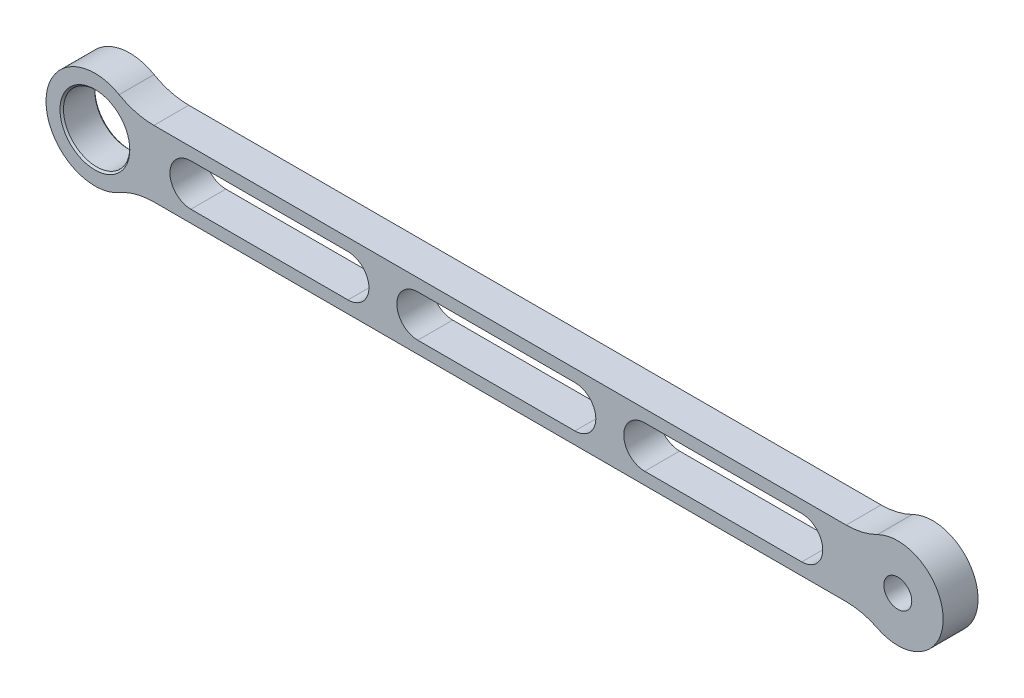
ISO-10303-21;
HEADER;
FILE_DESCRIPTION(('STEP AP214'),'2;1');
FILE_NAME('part.step','',(''),(''),'','','');
FILE_SCHEMA(('AUTOMOTIVE_DESIGN { 1 0 10303 214 1 1 1 1 }'));
ENDSEC;
DATA;
#1=APPLICATION_CONTEXT('core data for automotive mechanical design processes');
#2=APPLICATION_PROTOCOL_DEFINITION('international standard','automotive_design',2000,#1);
#3=PRODUCT_CONTEXT('',#1,'mechanical');
#4=PRODUCT('Part','Part','',(#3));
#5=PRODUCT_RELATED_PRODUCT_CATEGORY('part','',(#4));
#6=PRODUCT_DEFINITION_FORMATION('','',#4);
#7=PRODUCT_DEFINITION_CONTEXT('part definition',#1,'design');
#8=PRODUCT_DEFINITION('design','',#6,#7);
#9=PRODUCT_DEFINITION_SHAPE('','',#8);
#10=(LENGTH_UNIT() NAMED_UNIT(*) SI_UNIT(.MILLI.,.METRE.));
#11=(NAMED_UNIT(*) PLANE_ANGLE_UNIT() SI_UNIT($,.RADIAN.));
#12=(NAMED_UNIT(*) SI_UNIT($,.STERADIAN.) SOLID_ANGLE_UNIT());
#13=UNCERTAINTY_MEASURE_WITH_UNIT(LENGTH_MEASURE(1.E-05),#10,'distance_accuracy_value','');
#14=(GEOMETRIC_REPRESENTATION_CONTEXT(3) GLOBAL_UNCERTAINTY_ASSIGNED_CONTEXT((#13)) GLOBAL_UNIT_ASSIGNED_CONTEXT((#10,
#11,#12)) REPRESENTATION_CONTEXT('',''));
#15=CARTESIAN_POINT('',(0.,0.,0.));
#16=DIRECTION('',(0.,0.,1.));
#17=DIRECTION('',(1.,0.,0.));
#18=AXIS2_PLACEMENT_3D('',#15,#16,#17);
#19=CARTESIAN_POINT('',(215.20980054225,-29.5,10.));
#20=DIRECTION('',(0.,0.,-1.));
#21=DIRECTION('',(-1.,0.,0.));
#22=AXIS2_PLACEMENT_3D('',#19,#20,#21);
#23=CYLINDRICAL_SURFACE('',#22,20.);
#24=CARTESIAN_POINT('',(215.20980054225,-29.5,0.));
#25=DIRECTION('',(0.,0.,1.));
#26=DIRECTION('',(1.,0.,0.));
#27=AXIS2_PLACEMENT_3D('',#24,#25,#26);
#28=CIRCLE('',#27,20.);
#29=CARTESIAN_POINT('',(215.20980054225,-9.5,0.));
#30=VERTEX_POINT('',#29);
#31=CARTESIAN_POINT('',(224.173557789371,-11.6212121212123,0.));
#32=VERTEX_POINT('',#31);
#33=EDGE_CURVE('E274',#30,#32,#28,.F.);
#34=ORIENTED_EDGE('',*,*,#33,.T.);
#35=DIRECTION('',(0.,0.,-1.));
#36=VECTOR('',#35,1.);
#37=CARTESIAN_POINT('',(224.173557789371,-11.6212121212123,10.));
#38=LINE('',#37,#36);
#39=CARTESIAN_POINT('',(224.173557789371,-11.6212121212123,10.));
#40=VERTEX_POINT('',#39);
#41=EDGE_CURVE('E338',#40,#32,#38,.T.);
#42=ORIENTED_EDGE('',*,*,#41,.F.);
#43=CARTESIAN_POINT('',(215.20980054225,-29.5,10.));
#44=DIRECTION('',(0.,0.,1.));
#45=DIRECTION('',(1.,0.,0.));
#46=AXIS2_PLACEMENT_3D('',#43,#44,#45);
#47=CIRCLE('',#46,20.);
#48=CARTESIAN_POINT('',(215.20980054225,-9.5,10.));
#49=VERTEX_POINT('',#48);
#50=EDGE_CURVE('E281',#49,#40,#47,.F.);
#51=ORIENTED_EDGE('',*,*,#50,.F.);
#52=DIRECTION('',(0.,0.,-1.));
#53=VECTOR('',#52,1.);
#54=CARTESIAN_POINT('',(215.20980054225,-9.5,10.));
#55=LINE('',#54,#53);
#56=EDGE_CURVE('E302',#49,#30,#55,.T.);
#57=ORIENTED_EDGE('',*,*,#56,.T.);
#58=EDGE_LOOP('',(#34,#42,#51,#57));
#59=FACE_BOUND('',#58,.T.);
#60=ADVANCED_FACE('F38',(#59),#23,.F.);
#61=CARTESIAN_POINT('',(230.,0.,10.));
#62=DIRECTION('',(0.,0.,-1.));
#63=DIRECTION('',(-1.,0.,0.));
#64=AXIS2_PLACEMENT_3D('',#61,#62,#63);
#65=CYLINDRICAL_SURFACE('',#64,13.0000000000003);
#66=CARTESIAN_POINT('',(230.,0.,0.));
#67=DIRECTION('',(0.,0.,1.));
#68=DIRECTION('',(1.,0.,0.));
#69=AXIS2_PLACEMENT_3D('',#66,#67,#68);
#70=CIRCLE('',#69,13.0000000000003);
#71=CARTESIAN_POINT('',(224.173557789371,11.6212121212123,0.));
#72=VERTEX_POINT('',#71);
#73=EDGE_CURVE('E305',#32,#72,#70,.T.);
#74=ORIENTED_EDGE('',*,*,#73,.T.);
#75=DIRECTION('',(0.,0.,-1.));
#76=VECTOR('',#75,1.);
#77=CARTESIAN_POINT('',(224.173557789371,11.6212121212123,10.));
#78=LINE('',#77,#76);
#79=CARTESIAN_POINT('',(224.173557789371,11.6212121212123,10.));
#80=VERTEX_POINT('',#79);
#81=EDGE_CURVE('E335',#80,#72,#78,.T.);
#82=ORIENTED_EDGE('',*,*,#81,.F.);
#83=CARTESIAN_POINT('',(230.,0.,10.));
#84=DIRECTION('',(0.,0.,1.));
#85=DIRECTION('',(1.,0.,0.));
#86=AXIS2_PLACEMENT_3D('',#83,#84,#85);
#87=CIRCLE('',#86,13.0000000000003);
#88=EDGE_CURVE('E284',#40,#80,#87,.T.);
#89=ORIENTED_EDGE('',*,*,#88,.F.);
#90=ORIENTED_EDGE('',*,*,#41,.T.);
#91=EDGE_LOOP('',(#74,#82,#89,#90));
#92=FACE_BOUND('',#91,.T.);
#93=ADVANCED_FACE('F385',(#92),#65,.T.);
#94=CARTESIAN_POINT('',(215.20980054225,29.5,10.));
#95=DIRECTION('',(0.,0.,-1.));
#96=DIRECTION('',(-1.,0.,0.));
#97=AXIS2_PLACEMENT_3D('',#94,#95,#96);
#98=CYLINDRICAL_SURFACE('',#97,20.);
#99=CARTESIAN_POINT('',(215.20980054225,29.5,0.));
#100=DIRECTION('',(0.,0.,1.));
#101=DIRECTION('',(1.,0.,0.));
#102=AXIS2_PLACEMENT_3D('',#99,#100,#101);
#103=CIRCLE('',#102,20.);
#104=CARTESIAN_POINT('',(215.20980054225,9.50000000000002,0.));
#105=VERTEX_POINT('',#104);
#106=EDGE_CURVE('E307',#72,#105,#103,.F.);
#107=ORIENTED_EDGE('',*,*,#106,.T.);
#108=DIRECTION('',(0.,0.,-1.));
#109=VECTOR('',#108,1.);
#110=CARTESIAN_POINT('',(215.20980054225,9.50000000000002,10.));
#111=LINE('',#110,#109);
#112=CARTESIAN_POINT('',(215.20980054225,9.50000000000002,10.));
#113=VERTEX_POINT('',#112);
#114=EDGE_CURVE('E333',#113,#105,#111,.T.);
#115=ORIENTED_EDGE('',*,*,#114,.F.);
#116=CARTESIAN_POINT('',(215.20980054225,29.5,10.));
#117=DIRECTION('',(0.,0.,1.));
#118=DIRECTION('',(1.,0.,0.));
#119=AXIS2_PLACEMENT_3D('',#116,#117,#118);
#120=CIRCLE('',#119,20.);
#121=EDGE_CURVE('E287',#80,#113,#120,.F.);
#122=ORIENTED_EDGE('',*,*,#121,.F.);
#123=ORIENTED_EDGE('',*,*,#81,.T.);
#124=EDGE_LOOP('',(#107,#115,#122,#123));
#125=FACE_BOUND('',#124,.T.);
#126=ADVANCED_FACE('F391',(#125),#98,.F.);
#127=CARTESIAN_POINT('',(0.,9.50000000000018,10.));
#128=DIRECTION('',(0.,1.,0.));
#129=DIRECTION('',(-1.,0.,0.));
#130=AXIS2_PLACEMENT_3D('',#127,#128,#129);
#131=PLANE('',#130);
#132=DIRECTION('',(1.,0.,0.));
#133=VECTOR('',#132,1.);
#134=CARTESIAN_POINT('',(0.,9.50000000000018,0.));
#135=LINE('',#134,#133);
#136=CARTESIAN_POINT('',(16.904141504377,9.49999999999997,0.));
#137=VERTEX_POINT('',#136);
#138=EDGE_CURVE('E310',#137,#105,#135,.T.);
#139=ORIENTED_EDGE('',*,*,#138,.F.);
#140=DIRECTION('',(0.,0.,-1.));
#141=VECTOR('',#140,1.);
#142=CARTESIAN_POINT('',(16.904141504377,9.49999999999997,10.));
#143=LINE('',#142,#141);
#144=CARTESIAN_POINT('',(16.904141504377,9.49999999999997,10.));
#145=VERTEX_POINT('',#144);
#146=EDGE_CURVE('E331',#145,#137,#143,.T.);
#147=ORIENTED_EDGE('',*,*,#146,.F.);
#148=DIRECTION('',(1.,0.,0.));
#149=VECTOR('',#148,1.);
#150=CARTESIAN_POINT('',(0.,9.50000000000018,10.));
#151=LINE('',#150,#149);
#152=EDGE_CURVE('E289',#145,#113,#151,.T.);
#153=ORIENTED_EDGE('',*,*,#152,.T.);
#154=ORIENTED_EDGE('',*,*,#114,.T.);
#155=EDGE_LOOP('',(#139,#147,#153,#154));
#156=FACE_BOUND('',#155,.T.);
#157=ADVANCED_FACE('F397',(#156),#131,.T.);
#158=CARTESIAN_POINT('',(16.904141504377,29.5,10.));
#159=DIRECTION('',(0.,0.,-1.));
#160=DIRECTION('',(-1.,0.,0.));
#161=AXIS2_PLACEMENT_3D('',#158,#159,#160);
#162=CYLINDRICAL_SURFACE('',#161,20.);
#163=CARTESIAN_POINT('',(16.904141504377,29.5,0.));
#164=DIRECTION('',(0.,0.,1.));
#165=DIRECTION('',(1.,0.,0.));
#166=AXIS2_PLACEMENT_3D('',#163,#164,#165);
#167=CIRCLE('',#166,20.);
#168=CARTESIAN_POINT('',(6.96052885474347,12.1470588235294,0.));
#169=VERTEX_POINT('',#168);
#170=EDGE_CURVE('E313',#169,#137,#167,.T.);
#171=ORIENTED_EDGE('',*,*,#170,.F.);
#172=DIRECTION('',(0.,0.,-1.));
#173=VECTOR('',#172,1.);
#174=CARTESIAN_POINT('',(6.96052885474347,12.1470588235294,10.));
#175=LINE('',#174,#173);
#176=CARTESIAN_POINT('',(6.96052885474347,12.1470588235294,10.));
#177=VERTEX_POINT('',#176);
#178=EDGE_CURVE('E329',#177,#169,#175,.T.);
#179=ORIENTED_EDGE('',*,*,#178,.F.);
#180=CARTESIAN_POINT('',(16.904141504377,29.5,10.));
#181=DIRECTION('',(0.,0.,1.));
#182=DIRECTION('',(1.,0.,0.));
#183=AXIS2_PLACEMENT_3D('',#180,#181,#182);
#184=CIRCLE('',#183,20.);
#185=EDGE_CURVE('E292',#177,#145,#184,.T.);
#186=ORIENTED_EDGE('',*,*,#185,.T.);
#187=ORIENTED_EDGE('',*,*,#146,.T.);
#188=EDGE_LOOP('',(#171,#179,#186,#187));
#189=FACE_BOUND('',#188,.T.);
#190=ADVANCED_FACE('F401',(#189),#162,.F.);
#191=CARTESIAN_POINT('',(0.,0.,10.));
#192=DIRECTION('',(0.,0.,-1.));
#193=DIRECTION('',(-1.,0.,0.));
#194=AXIS2_PLACEMENT_3D('',#191,#192,#193);
#195=CYLINDRICAL_SURFACE('',#194,14.);
#196=CARTESIAN_POINT('',(0.,0.,0.));
#197=DIRECTION('',(0.,0.,1.));
#198=DIRECTION('',(1.,0.,0.));
#199=AXIS2_PLACEMENT_3D('',#196,#197,#198);
#200=CIRCLE('',#199,14.);
#201=CARTESIAN_POINT('',(6.96052885474344,-12.1470588235294,0.));
#202=VERTEX_POINT('',#201);
#203=EDGE_CURVE('E316',#169,#202,#200,.T.);
#204=ORIENTED_EDGE('',*,*,#203,.T.);
#205=DIRECTION('',(0.,0.,-1.));
#206=VECTOR('',#205,1.);
#207=CARTESIAN_POINT('',(6.96052885474344,-12.1470588235294,10.));
#208=LINE('',#207,#206);
#209=CARTESIAN_POINT('',(6.96052885474344,-12.1470588235294,10.));
#210=VERTEX_POINT('',#209);
#211=EDGE_CURVE('E326',#210,#202,#208,.T.);
#212=ORIENTED_EDGE('',*,*,#211,.F.);
#213=CARTESIAN_POINT('',(0.,0.,10.));
#214=DIRECTION('',(0.,0.,1.));
#215=DIRECTION('',(1.,0.,0.));
#216=AXIS2_PLACEMENT_3D('',#213,#214,#215);
#217=CIRCLE('',#216,14.);
#218=EDGE_CURVE('E295',#177,#210,#217,.T.);
#219=ORIENTED_EDGE('',*,*,#218,.F.);
#220=ORIENTED_EDGE('',*,*,#178,.T.);
#221=EDGE_LOOP('',(#204,#212,#219,#220));
#222=FACE_BOUND('',#221,.T.);
#223=ADVANCED_FACE('F405',(#222),#195,.T.);
#224=CARTESIAN_POINT('',(16.9041415043769,-29.5,10.));
#225=DIRECTION('',(0.,0.,-1.));
#226=DIRECTION('',(-1.,0.,0.));
#227=AXIS2_PLACEMENT_3D('',#224,#225,#226);
#228=CYLINDRICAL_SURFACE('',#227,20.);
#229=CARTESIAN_POINT('',(16.9041415043769,-29.5,0.));
#230=DIRECTION('',(0.,0.,1.));
#231=DIRECTION('',(1.,0.,0.));
#232=AXIS2_PLACEMENT_3D('',#229,#230,#231);
#233=CIRCLE('',#232,20.);
#234=CARTESIAN_POINT('',(16.9041415043769,-9.50000000000002,0.));
#235=VERTEX_POINT('',#234);
#236=EDGE_CURVE('E318',#202,#235,#233,.F.);
#237=ORIENTED_EDGE('',*,*,#236,.T.);
#238=DIRECTION('',(0.,0.,-1.));
#239=VECTOR('',#238,1.);
#240=CARTESIAN_POINT('',(16.9041415043769,-9.50000000000002,10.));
#241=LINE('',#240,#239);
#242=CARTESIAN_POINT('',(16.9041415043769,-9.50000000000002,10.));
#243=VERTEX_POINT('',#242);
#244=EDGE_CURVE('E324',#243,#235,#241,.T.);
#245=ORIENTED_EDGE('',*,*,#244,.F.);
#246=CARTESIAN_POINT('',(16.9041415043769,-29.5,10.));
#247=DIRECTION('',(0.,0.,1.));
#248=DIRECTION('',(1.,0.,0.));
#249=AXIS2_PLACEMENT_3D('',#246,#247,#248);
#250=CIRCLE('',#249,20.);
#251=EDGE_CURVE('E297',#210,#243,#250,.F.);
#252=ORIENTED_EDGE('',*,*,#251,.F.);
#253=ORIENTED_EDGE('',*,*,#211,.T.);
#254=EDGE_LOOP('',(#237,#245,#252,#253));
#255=FACE_BOUND('',#254,.T.);
#256=ADVANCED_FACE('F409',(#255),#228,.F.);
#257=CARTESIAN_POINT('',(0.,0.,10.));
#258=DIRECTION('',(0.,0.,-1.));
#259=DIRECTION('',(-1.,0.,0.));
#260=AXIS2_PLACEMENT_3D('',#257,#258,#259);
#261=CYLINDRICAL_SURFACE('',#260,9.5);
#262=CARTESIAN_POINT('',(0.,0.,0.500000000000032));
#263=DIRECTION('',(0.,0.,1.));
#264=DIRECTION('',(1.,0.,0.));
#265=AXIS2_PLACEMENT_3D('',#262,#263,#264);
#266=CIRCLE('',#265,9.5);
#267=CARTESIAN_POINT('',(9.5,0.,0.500000000000032));
#268=VERTEX_POINT('',#267);
#269=EDGE_CURVE('E46',#268,#268,#266,.F.);
#270=ORIENTED_EDGE('',*,*,#269,.T.);
#271=EDGE_LOOP('',(#270));
#272=FACE_BOUND('',#271,.T.);
#273=CARTESIAN_POINT('',(0.,0.,9.49999999999993));
#274=DIRECTION('',(0.,0.,1.));
#275=DIRECTION('',(1.,0.,0.));
#276=AXIS2_PLACEMENT_3D('',#273,#274,#275);
#277=CIRCLE('',#276,9.5);
#278=CARTESIAN_POINT('',(9.5,0.,9.49999999999993));
#279=VERTEX_POINT('',#278);
#280=EDGE_CURVE('E344',#279,#279,#277,.T.);
#281=ORIENTED_EDGE('',*,*,#280,.T.);
#282=EDGE_LOOP('',(#281));
#283=FACE_BOUND('',#282,.T.);
#284=ADVANCED_FACE('F349',(#272,#283),#261,.F.);
#285=CARTESIAN_POINT('',(0.,-9.50000000000002,10.));
#286=DIRECTION('',(0.,-1.,0.));
#287=DIRECTION('',(1.,0.,0.));
#288=AXIS2_PLACEMENT_3D('',#285,#286,#287);
#289=PLANE('',#288);
#290=DIRECTION('',(-1.,0.,0.));
#291=VECTOR('',#290,1.);
#292=CARTESIAN_POINT('',(0.,-9.50000000000002,0.));
#293=LINE('',#292,#291);
#294=EDGE_CURVE('E285',#30,#235,#293,.T.);
#295=ORIENTED_EDGE('',*,*,#294,.F.);
#296=ORIENTED_EDGE('',*,*,#56,.F.);
#297=DIRECTION('',(-1.,0.,0.));
#298=VECTOR('',#297,1.);
#299=CARTESIAN_POINT('',(0.,-9.50000000000002,10.));
#300=LINE('',#299,#298);
#301=EDGE_CURVE('E299',#49,#243,#300,.T.);
#302=ORIENTED_EDGE('',*,*,#301,.T.);
#303=ORIENTED_EDGE('',*,*,#244,.T.);
#304=EDGE_LOOP('',(#295,#296,#302,#303));
#305=FACE_BOUND('',#304,.T.);
#306=ADVANCED_FACE('F374',(#305),#289,.T.);
#307=CARTESIAN_POINT('',(0.,0.,10.));
#308=DIRECTION('',(0.,0.,1.));
#309=DIRECTION('',(1.,0.,0.));
#310=AXIS2_PLACEMENT_3D('',#307,#308,#309);
#311=PLANE('',#310);
#312=CARTESIAN_POINT('',(202.5,0.,10.));
#313=DIRECTION('',(0.,0.,1.));
#314=DIRECTION('',(1.,0.,0.));
#315=AXIS2_PLACEMENT_3D('',#312,#313,#314);
#316=CIRCLE('',#315,6.);
#317=CARTESIAN_POINT('',(202.5,-6.,10.));
#318=VERTEX_POINT('',#317);
#319=CARTESIAN_POINT('',(202.5,6.,10.));
#320=VERTEX_POINT('',#319);
#321=EDGE_CURVE('E53',#318,#320,#316,.T.);
#322=ORIENTED_EDGE('',*,*,#321,.F.);
#323=DIRECTION('',(1.,0.,0.));
#324=VECTOR('',#323,1.);
#325=CARTESIAN_POINT('',(157.5,-6.,10.));
#326=LINE('',#325,#324);
#327=CARTESIAN_POINT('',(157.5,-5.99999999999999,10.));
#328=VERTEX_POINT('',#327);
#329=EDGE_CURVE('E223',#328,#318,#326,.T.);
#330=ORIENTED_EDGE('',*,*,#329,.F.);
#331=CARTESIAN_POINT('',(157.5,0.,10.));
#332=DIRECTION('',(0.,0.,1.));
#333=DIRECTION('',(1.,0.,0.));
#334=AXIS2_PLACEMENT_3D('',#331,#332,#333);
#335=CIRCLE('',#334,6.);
#336=CARTESIAN_POINT('',(157.5,6.,10.));
#337=VERTEX_POINT('',#336);
#338=EDGE_CURVE('E238',#337,#328,#335,.T.);
#339=ORIENTED_EDGE('',*,*,#338,.F.);
#340=DIRECTION('',(-1.,0.,0.));
#341=VECTOR('',#340,1.);
#342=CARTESIAN_POINT('',(157.5,6.,10.));
#343=LINE('',#342,#341);
#344=EDGE_CURVE('E234',#320,#337,#343,.T.);
#345=ORIENTED_EDGE('',*,*,#344,.F.);
#346=EDGE_LOOP('',(#322,#330,#339,#345));
#347=FACE_BOUND('',#346,.T.);
#348=CARTESIAN_POINT('',(72.5000000000001,0.,10.));
#349=DIRECTION('',(0.,0.,1.));
#350=DIRECTION('',(1.,0.,0.));
#351=AXIS2_PLACEMENT_3D('',#348,#349,#350);
#352=CIRCLE('',#351,6.);
#353=CARTESIAN_POINT('',(72.5000000000001,-6.,10.));
#354=VERTEX_POINT('',#353);
#355=CARTESIAN_POINT('',(72.5000000000001,6.,10.));
#356=VERTEX_POINT('',#355);
#357=EDGE_CURVE('E61',#354,#356,#352,.T.);
#358=ORIENTED_EDGE('',*,*,#357,.F.);
#359=DIRECTION('',(1.,0.,0.));
#360=VECTOR('',#359,1.);
#361=CARTESIAN_POINT('',(27.5,-6.,10.));
#362=LINE('',#361,#360);
#363=CARTESIAN_POINT('',(27.5,-6.,10.));
#364=VERTEX_POINT('',#363);
#365=EDGE_CURVE('E196',#364,#354,#362,.T.);
#366=ORIENTED_EDGE('',*,*,#365,.F.);
#367=CARTESIAN_POINT('',(27.5,0.,10.));
#368=DIRECTION('',(0.,0.,1.));
#369=DIRECTION('',(1.,0.,0.));
#370=AXIS2_PLACEMENT_3D('',#367,#368,#369);
#371=CIRCLE('',#370,6.);
#372=CARTESIAN_POINT('',(27.5,6.,10.));
#373=VERTEX_POINT('',#372);
#374=EDGE_CURVE('E199',#373,#364,#371,.T.);
#375=ORIENTED_EDGE('',*,*,#374,.F.);
#376=DIRECTION('',(-1.,0.,0.));
#377=VECTOR('',#376,1.);
#378=CARTESIAN_POINT('',(27.5,6.,10.));
#379=LINE('',#378,#377);
#380=EDGE_CURVE('E208',#356,#373,#379,.T.);
#381=ORIENTED_EDGE('',*,*,#380,.F.);
#382=EDGE_LOOP('',(#358,#366,#375,#381));
#383=FACE_BOUND('',#382,.T.);
#384=CARTESIAN_POINT('',(92.5,0.,10.));
#385=DIRECTION('',(0.,0.,1.));
#386=DIRECTION('',(1.,0.,0.));
#387=AXIS2_PLACEMENT_3D('',#384,#385,#386);
#388=CIRCLE('',#387,6.);
#389=CARTESIAN_POINT('',(92.5,6.,10.));
#390=VERTEX_POINT('',#389);
#391=CARTESIAN_POINT('',(92.5,-6.,10.));
#392=VERTEX_POINT('',#391);
#393=EDGE_CURVE('E215',#390,#392,#388,.T.);
#394=ORIENTED_EDGE('',*,*,#393,.F.);
#395=DIRECTION('',(-1.,0.,0.));
#396=VECTOR('',#395,1.);
#397=CARTESIAN_POINT('',(137.499999917682,6.,10.));
#398=LINE('',#397,#396);
#399=CARTESIAN_POINT('',(137.499999917682,6.,10.));
#400=VERTEX_POINT('',#399);
#401=EDGE_CURVE('E253',#400,#390,#398,.T.);
#402=ORIENTED_EDGE('',*,*,#401,.F.);
#403=CARTESIAN_POINT('',(137.499999917682,0.,10.));
#404=DIRECTION('',(0.,0.,1.));
#405=DIRECTION('',(1.,0.,0.));
#406=AXIS2_PLACEMENT_3D('',#403,#404,#405);
#407=CIRCLE('',#406,6.);
#408=CARTESIAN_POINT('',(137.499999917682,-6.,10.));
#409=VERTEX_POINT('',#408);
#410=EDGE_CURVE('E267',#409,#400,#407,.T.);
#411=ORIENTED_EDGE('',*,*,#410,.F.);
#412=DIRECTION('',(1.,0.,0.));
#413=VECTOR('',#412,1.);
#414=CARTESIAN_POINT('',(137.499999917682,-6.,10.));
#415=LINE('',#414,#413);
#416=EDGE_CURVE('E264',#392,#409,#415,.T.);
#417=ORIENTED_EDGE('',*,*,#416,.F.);
#418=EDGE_LOOP('',(#394,#402,#411,#417));
#419=FACE_BOUND('',#418,.T.);
#420=CARTESIAN_POINT('',(0.,0.,10.));
#421=DIRECTION('',(0.,0.,1.));
#422=DIRECTION('',(1.,0.,0.));
#423=AXIS2_PLACEMENT_3D('',#420,#421,#422);
#424=CIRCLE('',#423,10.0000000000001);
#425=CARTESIAN_POINT('',(10.0000000000001,0.,10.));
#426=VERTEX_POINT('',#425);
#427=EDGE_CURVE('E11',#426,#426,#424,.F.);
#428=ORIENTED_EDGE('',*,*,#427,.T.);
#429=EDGE_LOOP('',(#428));
#430=FACE_BOUND('',#429,.T.);
#431=ORIENTED_EDGE('',*,*,#50,.T.);
#432=ORIENTED_EDGE('',*,*,#88,.T.);
#433=ORIENTED_EDGE('',*,*,#121,.T.);
#434=ORIENTED_EDGE('',*,*,#152,.F.);
#435=ORIENTED_EDGE('',*,*,#185,.F.);
#436=ORIENTED_EDGE('',*,*,#218,.T.);
#437=ORIENTED_EDGE('',*,*,#251,.T.);
#438=ORIENTED_EDGE('',*,*,#301,.F.);
#439=EDGE_LOOP('',(#431,#432,#433,#434,#435,#436,#437,#438));
#440=FACE_BOUND('',#439,.T.);
#441=CARTESIAN_POINT('',(230.,0.,10.));
#442=DIRECTION('',(0.,0.,1.));
#443=DIRECTION('',(1.,0.,0.));
#444=AXIS2_PLACEMENT_3D('',#441,#442,#443);
#445=CIRCLE('',#444,3.99999999999999);
#446=CARTESIAN_POINT('',(234.,0.,10.));
#447=VERTEX_POINT('',#446);
#448=EDGE_CURVE('E202',#447,#447,#445,.T.);
#449=ORIENTED_EDGE('',*,*,#448,.F.);
#450=EDGE_LOOP('',(#449));
#451=FACE_BOUND('',#450,.T.);
#452=ADVANCED_FACE('F359',(#347,#383,#419,#430,#440,#451),#311,.T.);
#453=CARTESIAN_POINT('',(0.,0.,0.));
#454=DIRECTION('',(0.,0.,1.));
#455=DIRECTION('',(1.,0.,0.));
#456=AXIS2_PLACEMENT_3D('',#453,#454,#455);
#457=PLANE('',#456);
#458=DIRECTION('',(1.,0.,0.));
#459=VECTOR('',#458,1.);
#460=CARTESIAN_POINT('',(157.5,-6.,0.));
#461=LINE('',#460,#459);
#462=CARTESIAN_POINT('',(157.5,-5.99999999999999,0.));
#463=VERTEX_POINT('',#462);
#464=CARTESIAN_POINT('',(202.5,-6.,0.));
#465=VERTEX_POINT('',#464);
#466=EDGE_CURVE('E229',#463,#465,#461,.T.);
#467=ORIENTED_EDGE('',*,*,#466,.T.);
#468=CARTESIAN_POINT('',(202.5,0.,0.));
#469=DIRECTION('',(0.,0.,1.));
#470=DIRECTION('',(1.,0.,0.));
#471=AXIS2_PLACEMENT_3D('',#468,#469,#470);
#472=CIRCLE('',#471,6.);
#473=CARTESIAN_POINT('',(202.5,6.,0.));
#474=VERTEX_POINT('',#473);
#475=EDGE_CURVE('E219',#465,#474,#472,.T.);
#476=ORIENTED_EDGE('',*,*,#475,.T.);
#477=DIRECTION('',(-1.,0.,0.));
#478=VECTOR('',#477,1.);
#479=CARTESIAN_POINT('',(157.5,6.,0.));
#480=LINE('',#479,#478);
#481=CARTESIAN_POINT('',(157.5,6.,0.));
#482=VERTEX_POINT('',#481);
#483=EDGE_CURVE('E222',#474,#482,#480,.T.);
#484=ORIENTED_EDGE('',*,*,#483,.T.);
#485=CARTESIAN_POINT('',(157.5,0.,0.));
#486=DIRECTION('',(0.,0.,1.));
#487=DIRECTION('',(1.,0.,0.));
#488=AXIS2_PLACEMENT_3D('',#485,#486,#487);
#489=CIRCLE('',#488,6.);
#490=EDGE_CURVE('E226',#482,#463,#489,.T.);
#491=ORIENTED_EDGE('',*,*,#490,.T.);
#492=EDGE_LOOP('',(#467,#476,#484,#491));
#493=FACE_BOUND('',#492,.T.);
#494=DIRECTION('',(1.,0.,0.));
#495=VECTOR('',#494,1.);
#496=CARTESIAN_POINT('',(27.5,-6.,0.));
#497=LINE('',#496,#495);
#498=CARTESIAN_POINT('',(27.5,-6.,0.));
#499=VERTEX_POINT('',#498);
#500=CARTESIAN_POINT('',(72.5000000000001,-6.,0.));
#501=VERTEX_POINT('',#500);
#502=EDGE_CURVE('E183',#499,#501,#497,.T.);
#503=ORIENTED_EDGE('',*,*,#502,.T.);
#504=CARTESIAN_POINT('',(72.5000000000001,0.,0.));
#505=DIRECTION('',(0.,0.,1.));
#506=DIRECTION('',(1.,0.,0.));
#507=AXIS2_PLACEMENT_3D('',#504,#505,#506);
#508=CIRCLE('',#507,6.);
#509=CARTESIAN_POINT('',(72.5000000000001,6.,0.));
#510=VERTEX_POINT('',#509);
#511=EDGE_CURVE('E177',#501,#510,#508,.T.);
#512=ORIENTED_EDGE('',*,*,#511,.T.);
#513=DIRECTION('',(-1.,0.,0.));
#514=VECTOR('',#513,1.);
#515=CARTESIAN_POINT('',(27.5,6.,0.));
#516=LINE('',#515,#514);
#517=CARTESIAN_POINT('',(27.5,6.,0.));
#518=VERTEX_POINT('',#517);
#519=EDGE_CURVE('E187',#510,#518,#516,.T.);
#520=ORIENTED_EDGE('',*,*,#519,.T.);
#521=CARTESIAN_POINT('',(27.5,0.,0.));
#522=DIRECTION('',(0.,0.,1.));
#523=DIRECTION('',(1.,0.,0.));
#524=AXIS2_PLACEMENT_3D('',#521,#522,#523);
#525=CIRCLE('',#524,6.);
#526=EDGE_CURVE('E191',#518,#499,#525,.T.);
#527=ORIENTED_EDGE('',*,*,#526,.T.);
#528=EDGE_LOOP('',(#503,#512,#520,#527));
#529=FACE_BOUND('',#528,.T.);
#530=DIRECTION('',(-1.,0.,0.));
#531=VECTOR('',#530,1.);
#532=CARTESIAN_POINT('',(137.499999917682,6.,0.));
#533=LINE('',#532,#531);
#534=CARTESIAN_POINT('',(137.499999917682,6.,0.));
#535=VERTEX_POINT('',#534);
#536=CARTESIAN_POINT('',(92.5,6.,0.));
#537=VERTEX_POINT('',#536);
#538=EDGE_CURVE('E259',#535,#537,#533,.T.);
#539=ORIENTED_EDGE('',*,*,#538,.T.);
#540=CARTESIAN_POINT('',(92.5,0.,0.));
#541=DIRECTION('',(0.,0.,1.));
#542=DIRECTION('',(1.,0.,0.));
#543=AXIS2_PLACEMENT_3D('',#540,#541,#542);
#544=CIRCLE('',#543,6.);
#545=CARTESIAN_POINT('',(92.5,-6.,0.));
#546=VERTEX_POINT('',#545);
#547=EDGE_CURVE('E249',#537,#546,#544,.T.);
#548=ORIENTED_EDGE('',*,*,#547,.T.);
#549=DIRECTION('',(1.,0.,0.));
#550=VECTOR('',#549,1.);
#551=CARTESIAN_POINT('',(137.499999917682,-6.,0.));
#552=LINE('',#551,#550);
#553=CARTESIAN_POINT('',(137.499999917682,-6.,0.));
#554=VERTEX_POINT('',#553);
#555=EDGE_CURVE('E252',#546,#554,#552,.T.);
#556=ORIENTED_EDGE('',*,*,#555,.T.);
#557=CARTESIAN_POINT('',(137.499999917682,0.,0.));
#558=DIRECTION('',(0.,0.,1.));
#559=DIRECTION('',(1.,0.,0.));
#560=AXIS2_PLACEMENT_3D('',#557,#558,#559);
#561=CIRCLE('',#560,6.);
#562=EDGE_CURVE('E256',#554,#535,#561,.T.);
#563=ORIENTED_EDGE('',*,*,#562,.T.);
#564=EDGE_LOOP('',(#539,#548,#556,#563));
#565=FACE_BOUND('',#564,.T.);
#566=CARTESIAN_POINT('',(0.,0.,0.));
#567=DIRECTION('',(0.,0.,1.));
#568=DIRECTION('',(1.,0.,0.));
#569=AXIS2_PLACEMENT_3D('',#566,#567,#568);
#570=CIRCLE('',#569,10.0000000000001);
#571=CARTESIAN_POINT('',(10.0000000000001,0.,0.));
#572=VERTEX_POINT('',#571);
#573=EDGE_CURVE('E341',#572,#572,#570,.T.);
#574=ORIENTED_EDGE('',*,*,#573,.T.);
#575=EDGE_LOOP('',(#574));
#576=FACE_BOUND('',#575,.T.);
#577=ORIENTED_EDGE('',*,*,#33,.F.);
#578=ORIENTED_EDGE('',*,*,#294,.T.);
#579=ORIENTED_EDGE('',*,*,#236,.F.);
#580=ORIENTED_EDGE('',*,*,#203,.F.);
#581=ORIENTED_EDGE('',*,*,#170,.T.);
#582=ORIENTED_EDGE('',*,*,#138,.T.);
#583=ORIENTED_EDGE('',*,*,#106,.F.);
#584=ORIENTED_EDGE('',*,*,#73,.F.);
#585=EDGE_LOOP('',(#577,#578,#579,#580,#581,#582,#583,#584));
#586=FACE_BOUND('',#585,.T.);
#587=CARTESIAN_POINT('',(230.,0.,0.));
#588=DIRECTION('',(0.,0.,1.));
#589=DIRECTION('',(1.,0.,0.));
#590=AXIS2_PLACEMENT_3D('',#587,#588,#589);
#591=CIRCLE('',#590,3.99999999999999);
#592=CARTESIAN_POINT('',(234.,0.,0.));
#593=VERTEX_POINT('',#592);
#594=EDGE_CURVE('E235',#593,#593,#591,.T.);
#595=ORIENTED_EDGE('',*,*,#594,.T.);
#596=EDGE_LOOP('',(#595));
#597=FACE_BOUND('',#596,.T.);
#598=ADVANCED_FACE('F193',(#493,#529,#565,#576,#586,#597),#457,.F.);
#599=CARTESIAN_POINT('',(0.,0.,0.));
#600=DIRECTION('',(0.,0.,-1.));
#601=DIRECTION('',(-1.,0.,0.));
#602=AXIS2_PLACEMENT_3D('',#599,#600,#601);
#603=CONICAL_SURFACE('',#602,10.0000000000001,0.785398163397481);
#604=ORIENTED_EDGE('',*,*,#269,.F.);
#605=EDGE_LOOP('',(#604));
#606=FACE_BOUND('',#605,.T.);
#607=ORIENTED_EDGE('',*,*,#573,.F.);
#608=EDGE_LOOP('',(#607));
#609=FACE_BOUND('',#608,.T.);
#610=ADVANCED_FACE('F352',(#606,#609),#603,.F.);
#611=CARTESIAN_POINT('',(0.,0.,9.49999999999993));
#612=DIRECTION('',(0.,0.,1.));
#613=DIRECTION('',(1.,0.,0.));
#614=AXIS2_PLACEMENT_3D('',#611,#612,#613);
#615=CONICAL_SURFACE('',#614,9.5,0.785398163397443);
#616=ORIENTED_EDGE('',*,*,#427,.F.);
#617=EDGE_LOOP('',(#616));
#618=FACE_BOUND('',#617,.T.);
#619=ORIENTED_EDGE('',*,*,#280,.F.);
#620=EDGE_LOOP('',(#619));
#621=FACE_BOUND('',#620,.T.);
#622=ADVANCED_FACE('F40',(#618,#621),#615,.F.);
#623=CARTESIAN_POINT('',(92.5,0.,0.));
#624=DIRECTION('',(0.,0.,1.));
#625=DIRECTION('',(1.,0.,0.));
#626=AXIS2_PLACEMENT_3D('',#623,#624,#625);
#627=CYLINDRICAL_SURFACE('',#626,6.);
#628=ORIENTED_EDGE('',*,*,#393,.T.);
#629=DIRECTION('',(0.,0.,1.));
#630=VECTOR('',#629,1.);
#631=CARTESIAN_POINT('',(92.5,-6.,0.));
#632=LINE('',#631,#630);
#633=EDGE_CURVE('E262',#546,#392,#632,.T.);
#634=ORIENTED_EDGE('',*,*,#633,.F.);
#635=ORIENTED_EDGE('',*,*,#547,.F.);
#636=DIRECTION('',(0.,0.,1.));
#637=VECTOR('',#636,1.);
#638=CARTESIAN_POINT('',(92.5,6.,0.));
#639=LINE('',#638,#637);
#640=EDGE_CURVE('E272',#537,#390,#639,.T.);
#641=ORIENTED_EDGE('',*,*,#640,.T.);
#642=EDGE_LOOP('',(#628,#634,#635,#641));
#643=FACE_BOUND('',#642,.T.);
#644=ADVANCED_FACE('F502',(#643),#627,.F.);
#645=CARTESIAN_POINT('',(137.499999917682,6.,0.));
#646=DIRECTION('',(0.,1.,0.));
#647=DIRECTION('',(0.,0.,1.));
#648=AXIS2_PLACEMENT_3D('',#645,#646,#647);
#649=PLANE('',#648);
#650=ORIENTED_EDGE('',*,*,#401,.T.);
#651=ORIENTED_EDGE('',*,*,#640,.F.);
#652=ORIENTED_EDGE('',*,*,#538,.F.);
#653=DIRECTION('',(0.,0.,1.));
#654=VECTOR('',#653,1.);
#655=CARTESIAN_POINT('',(137.499999917682,6.,0.));
#656=LINE('',#655,#654);
#657=EDGE_CURVE('E275',#535,#400,#656,.T.);
#658=ORIENTED_EDGE('',*,*,#657,.T.);
#659=EDGE_LOOP('',(#650,#651,#652,#658));
#660=FACE_BOUND('',#659,.T.);
#661=ADVANCED_FACE('F510',(#660),#649,.F.);
#662=CARTESIAN_POINT('',(137.499999917682,0.,0.));
#663=DIRECTION('',(0.,0.,1.));
#664=DIRECTION('',(1.,0.,0.));
#665=AXIS2_PLACEMENT_3D('',#662,#663,#664);
#666=CYLINDRICAL_SURFACE('',#665,6.);
#667=ORIENTED_EDGE('',*,*,#410,.T.);
#668=ORIENTED_EDGE('',*,*,#657,.F.);
#669=ORIENTED_EDGE('',*,*,#562,.F.);
#670=DIRECTION('',(0.,0.,1.));
#671=VECTOR('',#670,1.);
#672=CARTESIAN_POINT('',(137.499999917682,-6.,0.));
#673=LINE('',#672,#671);
#674=EDGE_CURVE('E277',#554,#409,#673,.T.);
#675=ORIENTED_EDGE('',*,*,#674,.T.);
#676=EDGE_LOOP('',(#667,#668,#669,#675));
#677=FACE_BOUND('',#676,.T.);
#678=ADVANCED_FACE('F518',(#677),#666,.F.);
#679=CARTESIAN_POINT('',(137.499999917682,-6.,0.));
#680=DIRECTION('',(0.,-1.,0.));
#681=DIRECTION('',(0.,0.,-1.));
#682=AXIS2_PLACEMENT_3D('',#679,#680,#681);
#683=PLANE('',#682);
#684=ORIENTED_EDGE('',*,*,#416,.T.);
#685=ORIENTED_EDGE('',*,*,#674,.F.);
#686=ORIENTED_EDGE('',*,*,#555,.F.);
#687=ORIENTED_EDGE('',*,*,#633,.T.);
#688=EDGE_LOOP('',(#684,#685,#686,#687));
#689=FACE_BOUND('',#688,.T.);
#690=ADVANCED_FACE('F527',(#689),#683,.F.);
#691=CARTESIAN_POINT('',(72.5000000000001,0.,0.));
#692=DIRECTION('',(0.,0.,1.));
#693=DIRECTION('',(1.,0.,0.));
#694=AXIS2_PLACEMENT_3D('',#691,#692,#693);
#695=CYLINDRICAL_SURFACE('',#694,6.);
#696=ORIENTED_EDGE('',*,*,#357,.T.);
#697=DIRECTION('',(0.,0.,1.));
#698=VECTOR('',#697,1.);
#699=CARTESIAN_POINT('',(72.5000000000001,6.,0.));
#700=LINE('',#699,#698);
#701=EDGE_CURVE('E173',#510,#356,#700,.T.);
#702=ORIENTED_EDGE('',*,*,#701,.F.);
#703=ORIENTED_EDGE('',*,*,#511,.F.);
#704=DIRECTION('',(0.,0.,1.));
#705=VECTOR('',#704,1.);
#706=CARTESIAN_POINT('',(72.5000000000001,-6.,0.));
#707=LINE('',#706,#705);
#708=EDGE_CURVE('E213',#501,#354,#707,.T.);
#709=ORIENTED_EDGE('',*,*,#708,.T.);
#710=EDGE_LOOP('',(#696,#702,#703,#709));
#711=FACE_BOUND('',#710,.T.);
#712=ADVANCED_FACE('F175',(#711),#695,.F.);
#713=CARTESIAN_POINT('',(27.5,-6.,0.));
#714=DIRECTION('',(0.,-1.,0.));
#715=DIRECTION('',(0.,0.,-1.));
#716=AXIS2_PLACEMENT_3D('',#713,#714,#715);
#717=PLANE('',#716);
#718=ORIENTED_EDGE('',*,*,#365,.T.);
#719=ORIENTED_EDGE('',*,*,#708,.F.);
#720=ORIENTED_EDGE('',*,*,#502,.F.);
#721=DIRECTION('',(0.,0.,1.));
#722=VECTOR('',#721,1.);
#723=CARTESIAN_POINT('',(27.5,-6.,0.));
#724=LINE('',#723,#722);
#725=EDGE_CURVE('E216',#499,#364,#724,.T.);
#726=ORIENTED_EDGE('',*,*,#725,.T.);
#727=EDGE_LOOP('',(#718,#719,#720,#726));
#728=FACE_BOUND('',#727,.T.);
#729=ADVANCED_FACE('F544',(#728),#717,.F.);
#730=CARTESIAN_POINT('',(27.5,0.,0.));
#731=DIRECTION('',(0.,0.,1.));
#732=DIRECTION('',(1.,0.,0.));
#733=AXIS2_PLACEMENT_3D('',#730,#731,#732);
#734=CYLINDRICAL_SURFACE('',#733,6.);
#735=ORIENTED_EDGE('',*,*,#374,.T.);
#736=ORIENTED_EDGE('',*,*,#725,.F.);
#737=ORIENTED_EDGE('',*,*,#526,.F.);
#738=DIRECTION('',(0.,0.,1.));
#739=VECTOR('',#738,1.);
#740=CARTESIAN_POINT('',(27.5,6.,0.));
#741=LINE('',#740,#739);
#742=EDGE_CURVE('E182',#518,#373,#741,.T.);
#743=ORIENTED_EDGE('',*,*,#742,.T.);
#744=EDGE_LOOP('',(#735,#736,#737,#743));
#745=FACE_BOUND('',#744,.T.);
#746=ADVANCED_FACE('F552',(#745),#734,.F.);
#747=CARTESIAN_POINT('',(27.5,6.,0.));
#748=DIRECTION('',(0.,1.,0.));
#749=DIRECTION('',(0.,0.,1.));
#750=AXIS2_PLACEMENT_3D('',#747,#748,#749);
#751=PLANE('',#750);
#752=ORIENTED_EDGE('',*,*,#380,.T.);
#753=ORIENTED_EDGE('',*,*,#742,.F.);
#754=ORIENTED_EDGE('',*,*,#519,.F.);
#755=ORIENTED_EDGE('',*,*,#701,.T.);
#756=EDGE_LOOP('',(#752,#753,#754,#755));
#757=FACE_BOUND('',#756,.T.);
#758=ADVANCED_FACE('F188',(#757),#751,.F.);
#759=CARTESIAN_POINT('',(202.5,0.,0.));
#760=DIRECTION('',(0.,0.,1.));
#761=DIRECTION('',(1.,0.,0.));
#762=AXIS2_PLACEMENT_3D('',#759,#760,#761);
#763=CYLINDRICAL_SURFACE('',#762,6.);
#764=ORIENTED_EDGE('',*,*,#321,.T.);
#765=DIRECTION('',(0.,0.,1.));
#766=VECTOR('',#765,1.);
#767=CARTESIAN_POINT('',(202.5,6.,0.));
#768=LINE('',#767,#766);
#769=EDGE_CURVE('E232',#474,#320,#768,.T.);
#770=ORIENTED_EDGE('',*,*,#769,.F.);
#771=ORIENTED_EDGE('',*,*,#475,.F.);
#772=DIRECTION('',(0.,0.,1.));
#773=VECTOR('',#772,1.);
#774=CARTESIAN_POINT('',(202.5,-6.,0.));
#775=LINE('',#774,#773);
#776=EDGE_CURVE('E209',#465,#318,#775,.T.);
#777=ORIENTED_EDGE('',*,*,#776,.T.);
#778=EDGE_LOOP('',(#764,#770,#771,#777));
#779=FACE_BOUND('',#778,.T.);
#780=ADVANCED_FACE('F569',(#779),#763,.F.);
#781=CARTESIAN_POINT('',(157.5,-6.,0.));
#782=DIRECTION('',(0.,-1.,0.));
#783=DIRECTION('',(0.,0.,-1.));
#784=AXIS2_PLACEMENT_3D('',#781,#782,#783);
#785=PLANE('',#784);
#786=ORIENTED_EDGE('',*,*,#329,.T.);
#787=ORIENTED_EDGE('',*,*,#776,.F.);
#788=ORIENTED_EDGE('',*,*,#466,.F.);
#789=DIRECTION('',(0.,0.,1.));
#790=VECTOR('',#789,1.);
#791=CARTESIAN_POINT('',(157.5,-5.99999999999999,0.));
#792=LINE('',#791,#790);
#793=EDGE_CURVE('E244',#463,#328,#792,.T.);
#794=ORIENTED_EDGE('',*,*,#793,.T.);
#795=EDGE_LOOP('',(#786,#787,#788,#794));
#796=FACE_BOUND('',#795,.T.);
#797=ADVANCED_FACE('F577',(#796),#785,.F.);
#798=CARTESIAN_POINT('',(157.5,0.,0.));
#799=DIRECTION('',(0.,0.,1.));
#800=DIRECTION('',(1.,0.,0.));
#801=AXIS2_PLACEMENT_3D('',#798,#799,#800);
#802=CYLINDRICAL_SURFACE('',#801,6.);
#803=ORIENTED_EDGE('',*,*,#338,.T.);
#804=ORIENTED_EDGE('',*,*,#793,.F.);
#805=ORIENTED_EDGE('',*,*,#490,.F.);
#806=DIRECTION('',(0.,0.,1.));
#807=VECTOR('',#806,1.);
#808=CARTESIAN_POINT('',(157.5,6.,0.));
#809=LINE('',#808,#807);
#810=EDGE_CURVE('E246',#482,#337,#809,.T.);
#811=ORIENTED_EDGE('',*,*,#810,.T.);
#812=EDGE_LOOP('',(#803,#804,#805,#811));
#813=FACE_BOUND('',#812,.T.);
#814=ADVANCED_FACE('F585',(#813),#802,.F.);
#815=CARTESIAN_POINT('',(157.5,6.,0.));
#816=DIRECTION('',(0.,1.,0.));
#817=DIRECTION('',(0.,0.,1.));
#818=AXIS2_PLACEMENT_3D('',#815,#816,#817);
#819=PLANE('',#818);
#820=ORIENTED_EDGE('',*,*,#344,.T.);
#821=ORIENTED_EDGE('',*,*,#810,.F.);
#822=ORIENTED_EDGE('',*,*,#483,.F.);
#823=ORIENTED_EDGE('',*,*,#769,.T.);
#824=EDGE_LOOP('',(#820,#821,#822,#823));
#825=FACE_BOUND('',#824,.T.);
#826=ADVANCED_FACE('F593',(#825),#819,.F.);
#827=CARTESIAN_POINT('',(230.,0.,0.));
#828=DIRECTION('',(0.,0.,1.));
#829=DIRECTION('',(1.,0.,0.));
#830=AXIS2_PLACEMENT_3D('',#827,#828,#829);
#831=CYLINDRICAL_SURFACE('',#830,3.99999999999999);
#832=ORIENTED_EDGE('',*,*,#594,.F.);
#833=EDGE_LOOP('',(#832));
#834=FACE_BOUND('',#833,.T.);
#835=ORIENTED_EDGE('',*,*,#448,.T.);
#836=EDGE_LOOP('',(#835));
#837=FACE_BOUND('',#836,.T.);
#838=ADVANCED_FACE('F371',(#834,#837),#831,.F.);
#839=CLOSED_SHELL('',(#60,#93,#126,#157,#190,#223,#256,#284,#306,#452,#598,#610,#622,#644,#661,
#678,#690,#712,#729,#746,#758,#780,#797,#814,#826,#838));
#840=MANIFOLD_SOLID_BREP('B2',#839);
#841=ADVANCED_BREP_SHAPE_REPRESENTATION('',(#18,#840),#14);
#842=SHAPE_DEFINITION_REPRESENTATION(#9,#841);
ENDSEC;
END-ISO-10303-21;
